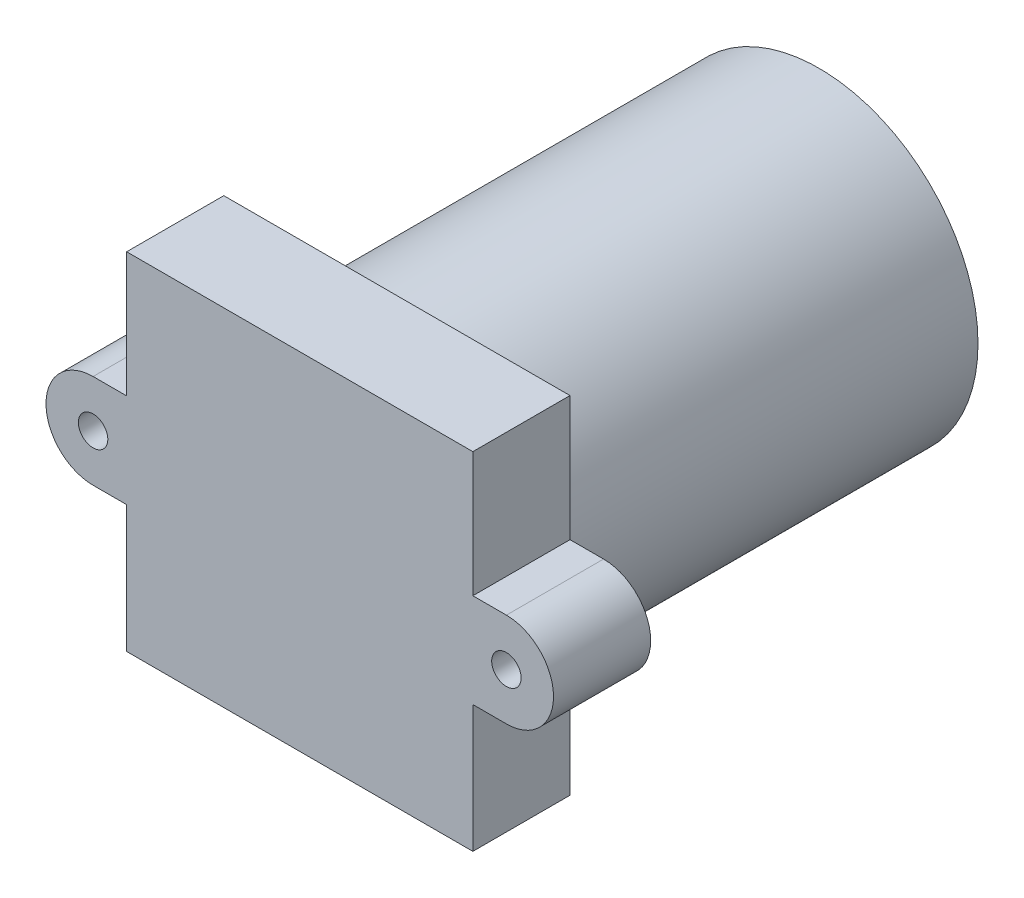
ISO-10303-21;
HEADER;
FILE_DESCRIPTION(('STEP AP214'),'2;1');
FILE_NAME('part.step','',(''),(''),'','','');
FILE_SCHEMA(('AUTOMOTIVE_DESIGN { 1 0 10303 214 1 1 1 1 }'));
ENDSEC;
DATA;
#1=APPLICATION_CONTEXT('core data for automotive mechanical design processes');
#2=APPLICATION_PROTOCOL_DEFINITION('international standard','automotive_design',2000,#1);
#3=PRODUCT_CONTEXT('',#1,'mechanical');
#4=PRODUCT('Part','Part','',(#3));
#5=PRODUCT_RELATED_PRODUCT_CATEGORY('part','',(#4));
#6=PRODUCT_DEFINITION_FORMATION('','',#4);
#7=PRODUCT_DEFINITION_CONTEXT('part definition',#1,'design');
#8=PRODUCT_DEFINITION('design','',#6,#7);
#9=PRODUCT_DEFINITION_SHAPE('','',#8);
#10=(LENGTH_UNIT() NAMED_UNIT(*) SI_UNIT(.MILLI.,.METRE.));
#11=(NAMED_UNIT(*) PLANE_ANGLE_UNIT() SI_UNIT($,.RADIAN.));
#12=(NAMED_UNIT(*) SI_UNIT($,.STERADIAN.) SOLID_ANGLE_UNIT());
#13=UNCERTAINTY_MEASURE_WITH_UNIT(LENGTH_MEASURE(1.E-05),#10,'distance_accuracy_value','');
#14=(GEOMETRIC_REPRESENTATION_CONTEXT(3) GLOBAL_UNCERTAINTY_ASSIGNED_CONTEXT((#13)) GLOBAL_UNIT_ASSIGNED_CONTEXT((#10,
#11,#12)) REPRESENTATION_CONTEXT('',''));
#15=CARTESIAN_POINT('',(0.,0.,0.));
#16=DIRECTION('',(0.,0.,1.));
#17=DIRECTION('',(1.,0.,0.));
#18=AXIS2_PLACEMENT_3D('',#15,#16,#17);
#19=CARTESIAN_POINT('',(0.,0.,18.2118));
#20=DIRECTION('',(0.,0.,-1.));
#21=DIRECTION('',(-1.,0.,0.));
#22=AXIS2_PLACEMENT_3D('',#19,#20,#21);
#23=CYLINDRICAL_SURFACE('',#22,6.858);
#24=CARTESIAN_POINT('',(0.,0.,18.2118));
#25=DIRECTION('',(0.,0.,1.));
#26=DIRECTION('',(1.,0.,0.));
#27=AXIS2_PLACEMENT_3D('',#24,#25,#26);
#28=CIRCLE('',#27,6.858);
#29=CARTESIAN_POINT('',(6.858,0.,18.2118));
#30=VERTEX_POINT('',#29);
#31=EDGE_CURVE('E11',#30,#30,#28,.T.);
#32=ORIENTED_EDGE('',*,*,#31,.F.);
#33=EDGE_LOOP('',(#32));
#34=FACE_BOUND('',#33,.T.);
#35=CARTESIAN_POINT('',(0.,0.,0.));
#36=DIRECTION('',(0.,0.,1.));
#37=DIRECTION('',(1.,0.,0.));
#38=AXIS2_PLACEMENT_3D('',#35,#36,#37);
#39=CIRCLE('',#38,6.858);
#40=CARTESIAN_POINT('',(6.858,0.,0.));
#41=VERTEX_POINT('',#40);
#42=EDGE_CURVE('E36',#41,#41,#39,.T.);
#43=ORIENTED_EDGE('',*,*,#42,.T.);
#44=EDGE_LOOP('',(#43));
#45=FACE_BOUND('',#44,.T.);
#46=ADVANCED_FACE('F33',(#34,#45),#23,.T.);
#47=CARTESIAN_POINT('',(0.,0.,0.));
#48=DIRECTION('',(0.,0.,1.));
#49=DIRECTION('',(1.,0.,0.));
#50=AXIS2_PLACEMENT_3D('',#47,#48,#49);
#51=PLANE('',#50);
#52=ORIENTED_EDGE('',*,*,#42,.F.);
#53=EDGE_LOOP('',(#52));
#54=FACE_BOUND('',#53,.T.);
#55=ADVANCED_FACE('F209',(#54),#51,.F.);
#56=CARTESIAN_POINT('',(-8.9154,0.0508000000000023,18.2118));
#57=DIRECTION('',(0.,0.,1.));
#58=DIRECTION('',(1.,0.,0.));
#59=AXIS2_PLACEMENT_3D('',#56,#57,#58);
#60=PLANE('',#59);
#61=CARTESIAN_POINT('',(8.9154,0.0508000000000006,18.2118));
#62=DIRECTION('',(0.,0.,1.));
#63=DIRECTION('',(1.,0.,0.));
#64=AXIS2_PLACEMENT_3D('',#61,#62,#63);
#65=CIRCLE('',#64,0.635000000000001);
#66=CARTESIAN_POINT('',(9.5504,0.0508000000000006,18.2118));
#67=VERTEX_POINT('',#66);
#68=EDGE_CURVE('E280',#67,#67,#65,.T.);
#69=ORIENTED_EDGE('',*,*,#68,.T.);
#70=EDGE_LOOP('',(#69));
#71=FACE_BOUND('',#70,.T.);
#72=DIRECTION('',(0.,-1.,0.));
#73=VECTOR('',#72,1.);
#74=CARTESIAN_POINT('',(-7.4676,7.4676,18.2118));
#75=LINE('',#74,#73);
#76=CARTESIAN_POINT('',(-7.4676,7.4676,18.2118));
#77=VERTEX_POINT('',#76);
#78=CARTESIAN_POINT('',(-7.4676,2.0828,18.2118));
#79=VERTEX_POINT('',#78);
#80=EDGE_CURVE('E155',#77,#79,#75,.T.);
#81=ORIENTED_EDGE('',*,*,#80,.F.);
#82=DIRECTION('',(-1.,0.,0.));
#83=VECTOR('',#82,1.);
#84=CARTESIAN_POINT('',(-7.4676,7.4676,18.2118));
#85=LINE('',#84,#83);
#86=CARTESIAN_POINT('',(7.4676,7.4676,18.2118));
#87=VERTEX_POINT('',#86);
#88=EDGE_CURVE('E96',#87,#77,#85,.T.);
#89=ORIENTED_EDGE('',*,*,#88,.F.);
#90=DIRECTION('',(0.,1.,0.));
#91=VECTOR('',#90,1.);
#92=CARTESIAN_POINT('',(7.4676,7.4676,18.2118));
#93=LINE('',#92,#91);
#94=CARTESIAN_POINT('',(7.4676,2.0828,18.2118));
#95=VERTEX_POINT('',#94);
#96=EDGE_CURVE('E90',#95,#87,#93,.T.);
#97=ORIENTED_EDGE('',*,*,#96,.F.);
#98=DIRECTION('',(-1.,0.,0.));
#99=VECTOR('',#98,1.);
#100=CARTESIAN_POINT('',(7.4676,2.0828,18.2118));
#101=LINE('',#100,#99);
#102=CARTESIAN_POINT('',(8.9154,2.0828,18.2118));
#103=VERTEX_POINT('',#102);
#104=EDGE_CURVE('E145',#103,#95,#101,.T.);
#105=ORIENTED_EDGE('',*,*,#104,.F.);
#106=CARTESIAN_POINT('',(8.9154,0.0508000000000006,18.2118));
#107=DIRECTION('',(0.,0.,1.));
#108=DIRECTION('',(1.,0.,0.));
#109=AXIS2_PLACEMENT_3D('',#106,#107,#108);
#110=CIRCLE('',#109,2.032);
#111=CARTESIAN_POINT('',(8.9154,-1.9812,18.2118));
#112=VERTEX_POINT('',#111);
#113=EDGE_CURVE('E173',#112,#103,#110,.T.);
#114=ORIENTED_EDGE('',*,*,#113,.F.);
#115=DIRECTION('',(1.,0.,0.));
#116=VECTOR('',#115,1.);
#117=CARTESIAN_POINT('',(7.4676,-1.9812,18.2118));
#118=LINE('',#117,#116);
#119=CARTESIAN_POINT('',(7.4676,-1.9812,18.2118));
#120=VERTEX_POINT('',#119);
#121=EDGE_CURVE('E171',#120,#112,#118,.T.);
#122=ORIENTED_EDGE('',*,*,#121,.F.);
#123=DIRECTION('',(0.,1.,0.));
#124=VECTOR('',#123,1.);
#125=CARTESIAN_POINT('',(7.4676,-1.9812,18.2118));
#126=LINE('',#125,#124);
#127=CARTESIAN_POINT('',(7.4676,-7.4676,18.2118));
#128=VERTEX_POINT('',#127);
#129=EDGE_CURVE('E169',#128,#120,#126,.T.);
#130=ORIENTED_EDGE('',*,*,#129,.F.);
#131=DIRECTION('',(1.,0.,0.));
#132=VECTOR('',#131,1.);
#133=CARTESIAN_POINT('',(-7.4676,-7.4676,18.2118));
#134=LINE('',#133,#132);
#135=CARTESIAN_POINT('',(-7.4676,-7.4676,18.2118));
#136=VERTEX_POINT('',#135);
#137=EDGE_CURVE('E167',#136,#128,#134,.T.);
#138=ORIENTED_EDGE('',*,*,#137,.F.);
#139=DIRECTION('',(0.,-1.,0.));
#140=VECTOR('',#139,1.);
#141=CARTESIAN_POINT('',(-7.4676,-1.9812,18.2118));
#142=LINE('',#141,#140);
#143=CARTESIAN_POINT('',(-7.4676,-1.9812,18.2118));
#144=VERTEX_POINT('',#143);
#145=EDGE_CURVE('E165',#144,#136,#142,.T.);
#146=ORIENTED_EDGE('',*,*,#145,.F.);
#147=DIRECTION('',(1.,0.,0.));
#148=VECTOR('',#147,1.);
#149=CARTESIAN_POINT('',(-7.4676,-1.9812,18.2118));
#150=LINE('',#149,#148);
#151=CARTESIAN_POINT('',(-8.9154,-1.9812,18.2118));
#152=VERTEX_POINT('',#151);
#153=EDGE_CURVE('E163',#152,#144,#150,.T.);
#154=ORIENTED_EDGE('',*,*,#153,.F.);
#155=CARTESIAN_POINT('',(-8.9154,0.0508000000000023,18.2118));
#156=DIRECTION('',(0.,0.,1.));
#157=DIRECTION('',(1.,0.,0.));
#158=AXIS2_PLACEMENT_3D('',#155,#156,#157);
#159=CIRCLE('',#158,2.032);
#160=CARTESIAN_POINT('',(-8.9154,2.0828,18.2118));
#161=VERTEX_POINT('',#160);
#162=EDGE_CURVE('E161',#161,#152,#159,.T.);
#163=ORIENTED_EDGE('',*,*,#162,.F.);
#164=DIRECTION('',(-1.,0.,0.));
#165=VECTOR('',#164,1.);
#166=CARTESIAN_POINT('',(-7.4676,2.0828,18.2118));
#167=LINE('',#166,#165);
#168=EDGE_CURVE('E158',#79,#161,#167,.T.);
#169=ORIENTED_EDGE('',*,*,#168,.F.);
#170=EDGE_LOOP('',(#81,#89,#97,#105,#114,#122,#130,#138,#146,#154,#163,#169));
#171=FACE_BOUND('',#170,.T.);
#172=CARTESIAN_POINT('',(-8.9154,0.0508000000000023,18.2118));
#173=DIRECTION('',(0.,0.,1.));
#174=DIRECTION('',(1.,0.,0.));
#175=AXIS2_PLACEMENT_3D('',#172,#173,#174);
#176=CIRCLE('',#175,0.635000000000001);
#177=CARTESIAN_POINT('',(-8.2804,0.0508000000000023,18.2118));
#178=VERTEX_POINT('',#177);
#179=EDGE_CURVE('E282',#178,#178,#176,.T.);
#180=ORIENTED_EDGE('',*,*,#179,.T.);
#181=EDGE_LOOP('',(#180));
#182=FACE_BOUND('',#181,.T.);
#183=ORIENTED_EDGE('',*,*,#31,.T.);
#184=EDGE_LOOP('',(#183));
#185=FACE_BOUND('',#184,.T.);
#186=ADVANCED_FACE('F211',(#71,#171,#182,#185),#60,.F.);
#187=CARTESIAN_POINT('',(-8.9154,0.0508000000000023,22.4028));
#188=DIRECTION('',(0.,0.,1.));
#189=DIRECTION('',(1.,0.,0.));
#190=AXIS2_PLACEMENT_3D('',#187,#188,#189);
#191=PLANE('',#190);
#192=CARTESIAN_POINT('',(-8.9154,0.0508000000000023,22.4028));
#193=DIRECTION('',(0.,0.,1.));
#194=DIRECTION('',(1.,0.,0.));
#195=AXIS2_PLACEMENT_3D('',#192,#193,#194);
#196=CIRCLE('',#195,0.635000000000001);
#197=CARTESIAN_POINT('',(-8.2804,0.0508000000000023,22.4028));
#198=VERTEX_POINT('',#197);
#199=EDGE_CURVE('E159',#198,#198,#196,.T.);
#200=ORIENTED_EDGE('',*,*,#199,.F.);
#201=EDGE_LOOP('',(#200));
#202=FACE_BOUND('',#201,.T.);
#203=DIRECTION('',(0.,-1.,0.));
#204=VECTOR('',#203,1.);
#205=CARTESIAN_POINT('',(-7.4676,7.4676,22.4028));
#206=LINE('',#205,#204);
#207=CARTESIAN_POINT('',(-7.4676,7.4676,22.4028));
#208=VERTEX_POINT('',#207);
#209=CARTESIAN_POINT('',(-7.4676,2.0828,22.4028));
#210=VERTEX_POINT('',#209);
#211=EDGE_CURVE('E178',#208,#210,#206,.T.);
#212=ORIENTED_EDGE('',*,*,#211,.T.);
#213=DIRECTION('',(-1.,0.,0.));
#214=VECTOR('',#213,1.);
#215=CARTESIAN_POINT('',(-7.4676,2.0828,22.4028));
#216=LINE('',#215,#214);
#217=CARTESIAN_POINT('',(-8.9154,2.0828,22.4028));
#218=VERTEX_POINT('',#217);
#219=EDGE_CURVE('E105',#210,#218,#216,.T.);
#220=ORIENTED_EDGE('',*,*,#219,.T.);
#221=CARTESIAN_POINT('',(-8.9154,0.0508000000000023,22.4028));
#222=DIRECTION('',(0.,0.,1.));
#223=DIRECTION('',(1.,0.,0.));
#224=AXIS2_PLACEMENT_3D('',#221,#222,#223);
#225=CIRCLE('',#224,2.032);
#226=CARTESIAN_POINT('',(-8.9154,-1.9812,22.4028));
#227=VERTEX_POINT('',#226);
#228=EDGE_CURVE('E291',#218,#227,#225,.T.);
#229=ORIENTED_EDGE('',*,*,#228,.T.);
#230=DIRECTION('',(1.,0.,0.));
#231=VECTOR('',#230,1.);
#232=CARTESIAN_POINT('',(-7.4676,-1.9812,22.4028));
#233=LINE('',#232,#231);
#234=CARTESIAN_POINT('',(-7.4676,-1.9812,22.4028));
#235=VERTEX_POINT('',#234);
#236=EDGE_CURVE('E293',#227,#235,#233,.T.);
#237=ORIENTED_EDGE('',*,*,#236,.T.);
#238=DIRECTION('',(0.,-1.,0.));
#239=VECTOR('',#238,1.);
#240=CARTESIAN_POINT('',(-7.4676,-1.9812,22.4028));
#241=LINE('',#240,#239);
#242=CARTESIAN_POINT('',(-7.4676,-7.4676,22.4028));
#243=VERTEX_POINT('',#242);
#244=EDGE_CURVE('E295',#235,#243,#241,.T.);
#245=ORIENTED_EDGE('',*,*,#244,.T.);
#246=DIRECTION('',(1.,0.,0.));
#247=VECTOR('',#246,1.);
#248=CARTESIAN_POINT('',(-7.4676,-7.4676,22.4028));
#249=LINE('',#248,#247);
#250=CARTESIAN_POINT('',(7.4676,-7.4676,22.4028));
#251=VERTEX_POINT('',#250);
#252=EDGE_CURVE('E297',#243,#251,#249,.T.);
#253=ORIENTED_EDGE('',*,*,#252,.T.);
#254=DIRECTION('',(0.,1.,0.));
#255=VECTOR('',#254,1.);
#256=CARTESIAN_POINT('',(7.4676,-1.9812,22.4028));
#257=LINE('',#256,#255);
#258=CARTESIAN_POINT('',(7.4676,-1.9812,22.4028));
#259=VERTEX_POINT('',#258);
#260=EDGE_CURVE('E299',#251,#259,#257,.T.);
#261=ORIENTED_EDGE('',*,*,#260,.T.);
#262=DIRECTION('',(1.,0.,0.));
#263=VECTOR('',#262,1.);
#264=CARTESIAN_POINT('',(7.4676,-1.9812,22.4028));
#265=LINE('',#264,#263);
#266=CARTESIAN_POINT('',(8.9154,-1.9812,22.4028));
#267=VERTEX_POINT('',#266);
#268=EDGE_CURVE('E301',#259,#267,#265,.T.);
#269=ORIENTED_EDGE('',*,*,#268,.T.);
#270=CARTESIAN_POINT('',(8.9154,0.0508000000000006,22.4028));
#271=DIRECTION('',(0.,0.,1.));
#272=DIRECTION('',(1.,0.,0.));
#273=AXIS2_PLACEMENT_3D('',#270,#271,#272);
#274=CIRCLE('',#273,2.032);
#275=CARTESIAN_POINT('',(8.9154,2.0828,22.4028));
#276=VERTEX_POINT('',#275);
#277=EDGE_CURVE('E137',#267,#276,#274,.T.);
#278=ORIENTED_EDGE('',*,*,#277,.T.);
#279=DIRECTION('',(-1.,0.,0.));
#280=VECTOR('',#279,1.);
#281=CARTESIAN_POINT('',(7.4676,2.0828,22.4028));
#282=LINE('',#281,#280);
#283=CARTESIAN_POINT('',(7.4676,2.0828,22.4028));
#284=VERTEX_POINT('',#283);
#285=EDGE_CURVE('E130',#276,#284,#282,.T.);
#286=ORIENTED_EDGE('',*,*,#285,.T.);
#287=DIRECTION('',(0.,1.,0.));
#288=VECTOR('',#287,1.);
#289=CARTESIAN_POINT('',(7.4676,7.4676,22.4028));
#290=LINE('',#289,#288);
#291=CARTESIAN_POINT('',(7.4676,7.4676,22.4028));
#292=VERTEX_POINT('',#291);
#293=EDGE_CURVE('E135',#284,#292,#290,.T.);
#294=ORIENTED_EDGE('',*,*,#293,.T.);
#295=DIRECTION('',(-1.,0.,0.));
#296=VECTOR('',#295,1.);
#297=CARTESIAN_POINT('',(-7.4676,7.4676,22.4028));
#298=LINE('',#297,#296);
#299=EDGE_CURVE('E49',#292,#208,#298,.T.);
#300=ORIENTED_EDGE('',*,*,#299,.T.);
#301=EDGE_LOOP('',(#212,#220,#229,#237,#245,#253,#261,#269,#278,#286,#294,#300));
#302=FACE_BOUND('',#301,.T.);
#303=CARTESIAN_POINT('',(8.9154,0.0508000000000006,22.4028));
#304=DIRECTION('',(0.,0.,1.));
#305=DIRECTION('',(1.,0.,0.));
#306=AXIS2_PLACEMENT_3D('',#303,#304,#305);
#307=CIRCLE('',#306,0.635000000000001);
#308=CARTESIAN_POINT('',(9.5504,0.0508000000000006,22.4028));
#309=VERTEX_POINT('',#308);
#310=EDGE_CURVE('E277',#309,#309,#307,.T.);
#311=ORIENTED_EDGE('',*,*,#310,.F.);
#312=EDGE_LOOP('',(#311));
#313=FACE_BOUND('',#312,.T.);
#314=ADVANCED_FACE('F132',(#202,#302,#313),#191,.T.);
#315=CARTESIAN_POINT('',(-7.4676,7.4676,22.4028));
#316=DIRECTION('',(1.,0.,0.));
#317=DIRECTION('',(0.,0.,-1.));
#318=AXIS2_PLACEMENT_3D('',#315,#316,#317);
#319=PLANE('',#318);
#320=ORIENTED_EDGE('',*,*,#80,.T.);
#321=DIRECTION('',(0.,0.,-1.));
#322=VECTOR('',#321,1.);
#323=CARTESIAN_POINT('',(-7.4676,2.0828,22.4028));
#324=LINE('',#323,#322);
#325=EDGE_CURVE('E203',#210,#79,#324,.T.);
#326=ORIENTED_EDGE('',*,*,#325,.F.);
#327=ORIENTED_EDGE('',*,*,#211,.F.);
#328=DIRECTION('',(0.,0.,-1.));
#329=VECTOR('',#328,1.);
#330=CARTESIAN_POINT('',(-7.4676,7.4676,22.4028));
#331=LINE('',#330,#329);
#332=EDGE_CURVE('E151',#208,#77,#331,.T.);
#333=ORIENTED_EDGE('',*,*,#332,.T.);
#334=EDGE_LOOP('',(#320,#326,#327,#333));
#335=FACE_BOUND('',#334,.T.);
#336=ADVANCED_FACE('F220',(#335),#319,.F.);
#337=CARTESIAN_POINT('',(-7.4676,2.0828,22.4028));
#338=DIRECTION('',(0.,-1.,0.));
#339=DIRECTION('',(1.,0.,0.));
#340=AXIS2_PLACEMENT_3D('',#337,#338,#339);
#341=PLANE('',#340);
#342=ORIENTED_EDGE('',*,*,#168,.T.);
#343=DIRECTION('',(0.,0.,-1.));
#344=VECTOR('',#343,1.);
#345=CARTESIAN_POINT('',(-8.9154,2.0828,22.4028));
#346=LINE('',#345,#344);
#347=EDGE_CURVE('E200',#218,#161,#346,.T.);
#348=ORIENTED_EDGE('',*,*,#347,.F.);
#349=ORIENTED_EDGE('',*,*,#219,.F.);
#350=ORIENTED_EDGE('',*,*,#325,.T.);
#351=EDGE_LOOP('',(#342,#348,#349,#350));
#352=FACE_BOUND('',#351,.T.);
#353=ADVANCED_FACE('F223',(#352),#341,.F.);
#354=CARTESIAN_POINT('',(-8.9154,0.0508000000000023,22.4028));
#355=DIRECTION('',(0.,0.,-1.));
#356=DIRECTION('',(-1.,0.,0.));
#357=AXIS2_PLACEMENT_3D('',#354,#355,#356);
#358=CYLINDRICAL_SURFACE('',#357,2.032);
#359=ORIENTED_EDGE('',*,*,#162,.T.);
#360=DIRECTION('',(0.,0.,-1.));
#361=VECTOR('',#360,1.);
#362=CARTESIAN_POINT('',(-8.9154,-1.9812,22.4028));
#363=LINE('',#362,#361);
#364=EDGE_CURVE('E197',#227,#152,#363,.T.);
#365=ORIENTED_EDGE('',*,*,#364,.F.);
#366=ORIENTED_EDGE('',*,*,#228,.F.);
#367=ORIENTED_EDGE('',*,*,#347,.T.);
#368=EDGE_LOOP('',(#359,#365,#366,#367));
#369=FACE_BOUND('',#368,.T.);
#370=ADVANCED_FACE('F227',(#369),#358,.T.);
#371=CARTESIAN_POINT('',(-7.4676,-1.9812,22.4028));
#372=DIRECTION('',(0.,1.,0.));
#373=DIRECTION('',(-1.,0.,0.));
#374=AXIS2_PLACEMENT_3D('',#371,#372,#373);
#375=PLANE('',#374);
#376=ORIENTED_EDGE('',*,*,#153,.T.);
#377=DIRECTION('',(0.,0.,-1.));
#378=VECTOR('',#377,1.);
#379=CARTESIAN_POINT('',(-7.4676,-1.9812,22.4028));
#380=LINE('',#379,#378);
#381=EDGE_CURVE('E194',#235,#144,#380,.T.);
#382=ORIENTED_EDGE('',*,*,#381,.F.);
#383=ORIENTED_EDGE('',*,*,#236,.F.);
#384=ORIENTED_EDGE('',*,*,#364,.T.);
#385=EDGE_LOOP('',(#376,#382,#383,#384));
#386=FACE_BOUND('',#385,.T.);
#387=ADVANCED_FACE('F230',(#386),#375,.F.);
#388=CARTESIAN_POINT('',(-7.4676,-1.9812,22.4028));
#389=DIRECTION('',(1.,0.,0.));
#390=DIRECTION('',(0.,0.,-1.));
#391=AXIS2_PLACEMENT_3D('',#388,#389,#390);
#392=PLANE('',#391);
#393=ORIENTED_EDGE('',*,*,#145,.T.);
#394=DIRECTION('',(0.,0.,-1.));
#395=VECTOR('',#394,1.);
#396=CARTESIAN_POINT('',(-7.4676,-7.4676,22.4028));
#397=LINE('',#396,#395);
#398=EDGE_CURVE('E191',#243,#136,#397,.T.);
#399=ORIENTED_EDGE('',*,*,#398,.F.);
#400=ORIENTED_EDGE('',*,*,#244,.F.);
#401=ORIENTED_EDGE('',*,*,#381,.T.);
#402=EDGE_LOOP('',(#393,#399,#400,#401));
#403=FACE_BOUND('',#402,.T.);
#404=ADVANCED_FACE('F234',(#403),#392,.F.);
#405=CARTESIAN_POINT('',(-7.4676,-7.4676,22.4028));
#406=DIRECTION('',(0.,1.,0.));
#407=DIRECTION('',(0.,0.,1.));
#408=AXIS2_PLACEMENT_3D('',#405,#406,#407);
#409=PLANE('',#408);
#410=ORIENTED_EDGE('',*,*,#137,.T.);
#411=DIRECTION('',(0.,0.,-1.));
#412=VECTOR('',#411,1.);
#413=CARTESIAN_POINT('',(7.4676,-7.4676,22.4028));
#414=LINE('',#413,#412);
#415=EDGE_CURVE('E188',#251,#128,#414,.T.);
#416=ORIENTED_EDGE('',*,*,#415,.F.);
#417=ORIENTED_EDGE('',*,*,#252,.F.);
#418=ORIENTED_EDGE('',*,*,#398,.T.);
#419=EDGE_LOOP('',(#410,#416,#417,#418));
#420=FACE_BOUND('',#419,.T.);
#421=ADVANCED_FACE('F238',(#420),#409,.F.);
#422=CARTESIAN_POINT('',(7.4676,-1.9812,22.4028));
#423=DIRECTION('',(-1.,0.,0.));
#424=DIRECTION('',(0.,-1.,0.));
#425=AXIS2_PLACEMENT_3D('',#422,#423,#424);
#426=PLANE('',#425);
#427=ORIENTED_EDGE('',*,*,#129,.T.);
#428=DIRECTION('',(0.,0.,-1.));
#429=VECTOR('',#428,1.);
#430=CARTESIAN_POINT('',(7.4676,-1.9812,22.4028));
#431=LINE('',#430,#429);
#432=EDGE_CURVE('E185',#259,#120,#431,.T.);
#433=ORIENTED_EDGE('',*,*,#432,.F.);
#434=ORIENTED_EDGE('',*,*,#260,.F.);
#435=ORIENTED_EDGE('',*,*,#415,.T.);
#436=EDGE_LOOP('',(#427,#433,#434,#435));
#437=FACE_BOUND('',#436,.T.);
#438=ADVANCED_FACE('F242',(#437),#426,.F.);
#439=CARTESIAN_POINT('',(7.4676,-1.9812,22.4028));
#440=DIRECTION('',(0.,1.,0.));
#441=DIRECTION('',(-1.,0.,0.));
#442=AXIS2_PLACEMENT_3D('',#439,#440,#441);
#443=PLANE('',#442);
#444=ORIENTED_EDGE('',*,*,#121,.T.);
#445=DIRECTION('',(0.,0.,-1.));
#446=VECTOR('',#445,1.);
#447=CARTESIAN_POINT('',(8.9154,-1.9812,22.4028));
#448=LINE('',#447,#446);
#449=EDGE_CURVE('E182',#267,#112,#448,.T.);
#450=ORIENTED_EDGE('',*,*,#449,.F.);
#451=ORIENTED_EDGE('',*,*,#268,.F.);
#452=ORIENTED_EDGE('',*,*,#432,.T.);
#453=EDGE_LOOP('',(#444,#450,#451,#452));
#454=FACE_BOUND('',#453,.T.);
#455=ADVANCED_FACE('F246',(#454),#443,.F.);
#456=CARTESIAN_POINT('',(8.9154,0.0508000000000006,22.4028));
#457=DIRECTION('',(0.,0.,-1.));
#458=DIRECTION('',(-1.,0.,0.));
#459=AXIS2_PLACEMENT_3D('',#456,#457,#458);
#460=CYLINDRICAL_SURFACE('',#459,2.032);
#461=ORIENTED_EDGE('',*,*,#113,.T.);
#462=DIRECTION('',(0.,0.,-1.));
#463=VECTOR('',#462,1.);
#464=CARTESIAN_POINT('',(8.9154,2.0828,22.4028));
#465=LINE('',#464,#463);
#466=EDGE_CURVE('E146',#276,#103,#465,.T.);
#467=ORIENTED_EDGE('',*,*,#466,.F.);
#468=ORIENTED_EDGE('',*,*,#277,.F.);
#469=ORIENTED_EDGE('',*,*,#449,.T.);
#470=EDGE_LOOP('',(#461,#467,#468,#469));
#471=FACE_BOUND('',#470,.T.);
#472=ADVANCED_FACE('F250',(#471),#460,.T.);
#473=CARTESIAN_POINT('',(7.4676,2.0828,22.4028));
#474=DIRECTION('',(0.,-1.,0.));
#475=DIRECTION('',(1.,0.,0.));
#476=AXIS2_PLACEMENT_3D('',#473,#474,#475);
#477=PLANE('',#476);
#478=ORIENTED_EDGE('',*,*,#104,.T.);
#479=DIRECTION('',(0.,0.,-1.));
#480=VECTOR('',#479,1.);
#481=CARTESIAN_POINT('',(7.4676,2.0828,22.4028));
#482=LINE('',#481,#480);
#483=EDGE_CURVE('E142',#284,#95,#482,.T.);
#484=ORIENTED_EDGE('',*,*,#483,.F.);
#485=ORIENTED_EDGE('',*,*,#285,.F.);
#486=ORIENTED_EDGE('',*,*,#466,.T.);
#487=EDGE_LOOP('',(#478,#484,#485,#486));
#488=FACE_BOUND('',#487,.T.);
#489=ADVANCED_FACE('F143',(#488),#477,.F.);
#490=CARTESIAN_POINT('',(7.4676,7.4676,22.4028));
#491=DIRECTION('',(-1.,0.,0.));
#492=DIRECTION('',(0.,-1.,0.));
#493=AXIS2_PLACEMENT_3D('',#490,#491,#492);
#494=PLANE('',#493);
#495=ORIENTED_EDGE('',*,*,#96,.T.);
#496=DIRECTION('',(0.,0.,-1.));
#497=VECTOR('',#496,1.);
#498=CARTESIAN_POINT('',(7.4676,7.4676,22.4028));
#499=LINE('',#498,#497);
#500=EDGE_CURVE('E147',#292,#87,#499,.T.);
#501=ORIENTED_EDGE('',*,*,#500,.F.);
#502=ORIENTED_EDGE('',*,*,#293,.F.);
#503=ORIENTED_EDGE('',*,*,#483,.T.);
#504=EDGE_LOOP('',(#495,#501,#502,#503));
#505=FACE_BOUND('',#504,.T.);
#506=ADVANCED_FACE('F149',(#505),#494,.F.);
#507=CARTESIAN_POINT('',(-7.4676,7.4676,22.4028));
#508=DIRECTION('',(0.,-1.,0.));
#509=DIRECTION('',(1.,0.,0.));
#510=AXIS2_PLACEMENT_3D('',#507,#508,#509);
#511=PLANE('',#510);
#512=ORIENTED_EDGE('',*,*,#88,.T.);
#513=ORIENTED_EDGE('',*,*,#332,.F.);
#514=ORIENTED_EDGE('',*,*,#299,.F.);
#515=ORIENTED_EDGE('',*,*,#500,.T.);
#516=EDGE_LOOP('',(#512,#513,#514,#515));
#517=FACE_BOUND('',#516,.T.);
#518=ADVANCED_FACE('F259',(#517),#511,.F.);
#519=CARTESIAN_POINT('',(-8.9154,0.0508000000000023,22.4028));
#520=DIRECTION('',(0.,0.,-1.));
#521=DIRECTION('',(-1.,0.,0.));
#522=AXIS2_PLACEMENT_3D('',#519,#520,#521);
#523=CYLINDRICAL_SURFACE('',#522,0.635000000000001);
#524=ORIENTED_EDGE('',*,*,#199,.T.);
#525=EDGE_LOOP('',(#524));
#526=FACE_BOUND('',#525,.T.);
#527=ORIENTED_EDGE('',*,*,#179,.F.);
#528=EDGE_LOOP('',(#527));
#529=FACE_BOUND('',#528,.T.);
#530=ADVANCED_FACE('F261',(#526,#529),#523,.F.);
#531=CARTESIAN_POINT('',(8.9154,0.0508000000000006,22.4028));
#532=DIRECTION('',(0.,0.,-1.));
#533=DIRECTION('',(-1.,0.,0.));
#534=AXIS2_PLACEMENT_3D('',#531,#532,#533);
#535=CYLINDRICAL_SURFACE('',#534,0.635000000000001);
#536=ORIENTED_EDGE('',*,*,#310,.T.);
#537=EDGE_LOOP('',(#536));
#538=FACE_BOUND('',#537,.T.);
#539=ORIENTED_EDGE('',*,*,#68,.F.);
#540=EDGE_LOOP('',(#539));
#541=FACE_BOUND('',#540,.T.);
#542=ADVANCED_FACE('F268',(#538,#541),#535,.F.);
#543=CLOSED_SHELL('',(#46,#55,#186,#314,#336,#353,#370,#387,#404,#421,#438,#455,#472,#489,#506,
#518,#530,#542));
#544=MANIFOLD_SOLID_BREP('B2',#543);
#545=ADVANCED_BREP_SHAPE_REPRESENTATION('',(#18,#544),#14);
#546=SHAPE_DEFINITION_REPRESENTATION(#9,#545);
ENDSEC;
END-ISO-10303-21;
